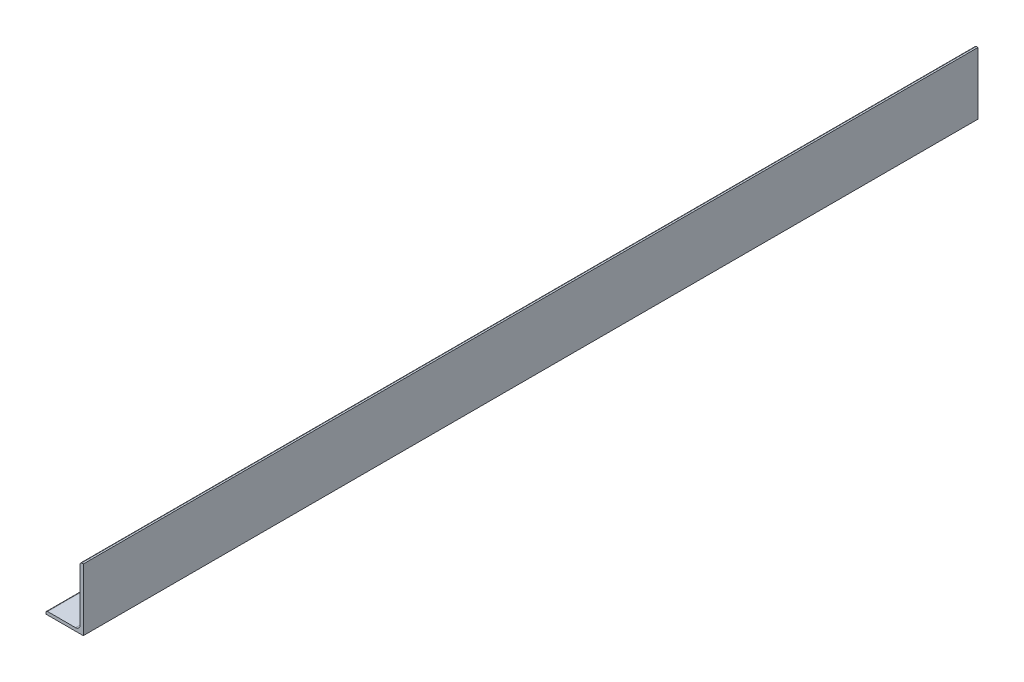
ISO-10303-21;
HEADER;
FILE_DESCRIPTION(('STEP AP214'),'2;1');
FILE_NAME('part.step','',(''),(''),'','','');
FILE_SCHEMA(('AUTOMOTIVE_DESIGN { 1 0 10303 214 1 1 1 1 }'));
ENDSEC;
DATA;
#1=APPLICATION_CONTEXT('core data for automotive mechanical design processes');
#2=APPLICATION_PROTOCOL_DEFINITION('international standard','automotive_design',2000,#1);
#3=PRODUCT_CONTEXT('',#1,'mechanical');
#4=PRODUCT('Part','Part','',(#3));
#5=PRODUCT_RELATED_PRODUCT_CATEGORY('part','',(#4));
#6=PRODUCT_DEFINITION_FORMATION('','',#4);
#7=PRODUCT_DEFINITION_CONTEXT('part definition',#1,'design');
#8=PRODUCT_DEFINITION('design','',#6,#7);
#9=PRODUCT_DEFINITION_SHAPE('','',#8);
#10=(LENGTH_UNIT() NAMED_UNIT(*) SI_UNIT(.MILLI.,.METRE.));
#11=(NAMED_UNIT(*) PLANE_ANGLE_UNIT() SI_UNIT($,.RADIAN.));
#12=(NAMED_UNIT(*) SI_UNIT($,.STERADIAN.) SOLID_ANGLE_UNIT());
#13=UNCERTAINTY_MEASURE_WITH_UNIT(LENGTH_MEASURE(1.E-05),#10,'distance_accuracy_value','');
#14=(GEOMETRIC_REPRESENTATION_CONTEXT(3) GLOBAL_UNCERTAINTY_ASSIGNED_CONTEXT((#13)) GLOBAL_UNIT_ASSIGNED_CONTEXT((#10,
#11,#12)) REPRESENTATION_CONTEXT('',''));
#15=CARTESIAN_POINT('',(0.,0.,0.));
#16=DIRECTION('',(0.,0.,1.));
#17=DIRECTION('',(1.,0.,0.));
#18=AXIS2_PLACEMENT_3D('',#15,#16,#17);
#19=CARTESIAN_POINT('',(-19.05,-30.1625,457.2));
#20=DIRECTION('',(1.,0.,0.));
#21=DIRECTION('',(0.,0.,-1.));
#22=AXIS2_PLACEMENT_3D('',#19,#20,#21);
#23=PLANE('',#22);
#24=DIRECTION('',(0.,-1.,0.));
#25=VECTOR('',#24,1.);
#26=CARTESIAN_POINT('',(-19.05,-30.1625,-457.2));
#27=LINE('',#26,#25);
#28=CARTESIAN_POINT('',(-19.05,-30.1625,-457.2));
#29=VERTEX_POINT('',#28);
#30=CARTESIAN_POINT('',(-19.05,-31.75,-457.2));
#31=VERTEX_POINT('',#30);
#32=EDGE_CURVE('E150',#29,#31,#27,.T.);
#33=ORIENTED_EDGE('',*,*,#32,.T.);
#34=DIRECTION('',(0.,0.,-1.));
#35=VECTOR('',#34,1.);
#36=CARTESIAN_POINT('',(-19.05,-31.75,457.2));
#37=LINE('',#36,#35);
#38=CARTESIAN_POINT('',(-19.05,-31.75,457.2));
#39=VERTEX_POINT('',#38);
#40=EDGE_CURVE('E11',#39,#31,#37,.T.);
#41=ORIENTED_EDGE('',*,*,#40,.F.);
#42=DIRECTION('',(0.,-1.,0.));
#43=VECTOR('',#42,1.);
#44=CARTESIAN_POINT('',(-19.05,-30.1625,457.2));
#45=LINE('',#44,#43);
#46=CARTESIAN_POINT('',(-19.05,-30.1625,457.2));
#47=VERTEX_POINT('',#46);
#48=EDGE_CURVE('E175',#47,#39,#45,.T.);
#49=ORIENTED_EDGE('',*,*,#48,.F.);
#50=DIRECTION('',(0.,0.,-1.));
#51=VECTOR('',#50,1.);
#52=CARTESIAN_POINT('',(-19.05,-30.1625,457.2));
#53=LINE('',#52,#51);
#54=EDGE_CURVE('E146',#47,#29,#53,.T.);
#55=ORIENTED_EDGE('',*,*,#54,.T.);
#56=EDGE_LOOP('',(#33,#41,#49,#55));
#57=FACE_BOUND('',#56,.T.);
#58=ADVANCED_FACE('F43',(#57),#23,.F.);
#59=CARTESIAN_POINT('',(-19.05,-31.75,457.2));
#60=DIRECTION('',(0.,1.,0.));
#61=DIRECTION('',(-1.,0.,0.));
#62=AXIS2_PLACEMENT_3D('',#59,#60,#61);
#63=PLANE('',#62);
#64=DIRECTION('',(1.,0.,0.));
#65=VECTOR('',#64,1.);
#66=CARTESIAN_POINT('',(-19.05,-31.75,-457.2));
#67=LINE('',#66,#65);
#68=CARTESIAN_POINT('',(19.05,-31.75,-457.2));
#69=VERTEX_POINT('',#68);
#70=EDGE_CURVE('E154',#31,#69,#67,.T.);
#71=ORIENTED_EDGE('',*,*,#70,.T.);
#72=DIRECTION('',(0.,0.,-1.));
#73=VECTOR('',#72,1.);
#74=CARTESIAN_POINT('',(19.05,-31.75,457.2));
#75=LINE('',#74,#73);
#76=CARTESIAN_POINT('',(19.05,-31.75,457.2));
#77=VERTEX_POINT('',#76);
#78=EDGE_CURVE('E52',#77,#69,#75,.T.);
#79=ORIENTED_EDGE('',*,*,#78,.F.);
#80=DIRECTION('',(1.,0.,0.));
#81=VECTOR('',#80,1.);
#82=CARTESIAN_POINT('',(-19.05,-31.75,457.2));
#83=LINE('',#82,#81);
#84=EDGE_CURVE('E106',#39,#77,#83,.T.);
#85=ORIENTED_EDGE('',*,*,#84,.F.);
#86=ORIENTED_EDGE('',*,*,#40,.T.);
#87=EDGE_LOOP('',(#71,#79,#85,#86));
#88=FACE_BOUND('',#87,.T.);
#89=ADVANCED_FACE('F231',(#88),#63,.F.);
#90=CARTESIAN_POINT('',(19.05,-31.75,457.2));
#91=DIRECTION('',(-1.,0.,0.));
#92=DIRECTION('',(0.,-1.,0.));
#93=AXIS2_PLACEMENT_3D('',#90,#91,#92);
#94=PLANE('',#93);
#95=DIRECTION('',(0.,1.,0.));
#96=VECTOR('',#95,1.);
#97=CARTESIAN_POINT('',(19.05,-31.75,-457.2));
#98=LINE('',#97,#96);
#99=CARTESIAN_POINT('',(19.05,31.75,-457.2));
#100=VERTEX_POINT('',#99);
#101=EDGE_CURVE('E157',#69,#100,#98,.T.);
#102=ORIENTED_EDGE('',*,*,#101,.T.);
#103=DIRECTION('',(0.,0.,-1.));
#104=VECTOR('',#103,1.);
#105=CARTESIAN_POINT('',(19.05,31.75,457.2));
#106=LINE('',#105,#104);
#107=CARTESIAN_POINT('',(19.05,31.75,457.2));
#108=VERTEX_POINT('',#107);
#109=EDGE_CURVE('E190',#108,#100,#106,.T.);
#110=ORIENTED_EDGE('',*,*,#109,.F.);
#111=DIRECTION('',(0.,1.,0.));
#112=VECTOR('',#111,1.);
#113=CARTESIAN_POINT('',(19.05,-31.75,457.2));
#114=LINE('',#113,#112);
#115=EDGE_CURVE('E200',#77,#108,#114,.T.);
#116=ORIENTED_EDGE('',*,*,#115,.F.);
#117=ORIENTED_EDGE('',*,*,#78,.T.);
#118=EDGE_LOOP('',(#102,#110,#116,#117));
#119=FACE_BOUND('',#118,.T.);
#120=ADVANCED_FACE('F198',(#119),#94,.F.);
#121=CARTESIAN_POINT('',(17.4625,31.75,457.2));
#122=DIRECTION('',(0.,-1.,0.));
#123=DIRECTION('',(1.,0.,0.));
#124=AXIS2_PLACEMENT_3D('',#121,#122,#123);
#125=PLANE('',#124);
#126=DIRECTION('',(-1.,0.,0.));
#127=VECTOR('',#126,1.);
#128=CARTESIAN_POINT('',(17.4625,31.75,-457.2));
#129=LINE('',#128,#127);
#130=CARTESIAN_POINT('',(17.4625,31.75,-457.2));
#131=VERTEX_POINT('',#130);
#132=EDGE_CURVE('E160',#100,#131,#129,.T.);
#133=ORIENTED_EDGE('',*,*,#132,.T.);
#134=DIRECTION('',(0.,0.,-1.));
#135=VECTOR('',#134,1.);
#136=CARTESIAN_POINT('',(17.4625,31.75,457.2));
#137=LINE('',#136,#135);
#138=CARTESIAN_POINT('',(17.4625,31.75,457.2));
#139=VERTEX_POINT('',#138);
#140=EDGE_CURVE('E186',#139,#131,#137,.T.);
#141=ORIENTED_EDGE('',*,*,#140,.F.);
#142=DIRECTION('',(-1.,0.,0.));
#143=VECTOR('',#142,1.);
#144=CARTESIAN_POINT('',(17.4625,31.75,457.2));
#145=LINE('',#144,#143);
#146=EDGE_CURVE('E217',#108,#139,#145,.T.);
#147=ORIENTED_EDGE('',*,*,#146,.F.);
#148=ORIENTED_EDGE('',*,*,#109,.T.);
#149=EDGE_LOOP('',(#133,#141,#147,#148));
#150=FACE_BOUND('',#149,.T.);
#151=ADVANCED_FACE('F209',(#150),#125,.F.);
#152=CARTESIAN_POINT('',(17.4625,30.1625,457.2));
#153=DIRECTION('',(0.,0.,-1.));
#154=DIRECTION('',(-1.,0.,0.));
#155=AXIS2_PLACEMENT_3D('',#152,#153,#154);
#156=CYLINDRICAL_SURFACE('',#155,1.5875);
#157=CARTESIAN_POINT('',(17.4625,30.1625,-457.2));
#158=DIRECTION('',(0.,0.,1.));
#159=DIRECTION('',(-1.,0.,0.));
#160=AXIS2_PLACEMENT_3D('',#157,#158,#159);
#161=CIRCLE('',#160,1.5875);
#162=CARTESIAN_POINT('',(15.875,30.1625,-457.2));
#163=VERTEX_POINT('',#162);
#164=EDGE_CURVE('E163',#131,#163,#161,.T.);
#165=ORIENTED_EDGE('',*,*,#164,.T.);
#166=DIRECTION('',(0.,0.,-1.));
#167=VECTOR('',#166,1.);
#168=CARTESIAN_POINT('',(15.875,30.1625,457.2));
#169=LINE('',#168,#167);
#170=CARTESIAN_POINT('',(15.875,30.1625,457.2));
#171=VERTEX_POINT('',#170);
#172=EDGE_CURVE('E182',#171,#163,#169,.T.);
#173=ORIENTED_EDGE('',*,*,#172,.F.);
#174=CARTESIAN_POINT('',(17.4625,30.1625,457.2));
#175=DIRECTION('',(0.,0.,1.));
#176=DIRECTION('',(-1.,0.,0.));
#177=AXIS2_PLACEMENT_3D('',#174,#175,#176);
#178=CIRCLE('',#177,1.5875);
#179=EDGE_CURVE('E215',#139,#171,#178,.T.);
#180=ORIENTED_EDGE('',*,*,#179,.F.);
#181=ORIENTED_EDGE('',*,*,#140,.T.);
#182=EDGE_LOOP('',(#165,#173,#180,#181));
#183=FACE_BOUND('',#182,.T.);
#184=ADVANCED_FACE('F213',(#183),#156,.T.);
#185=CARTESIAN_POINT('',(15.875,30.1625,457.2));
#186=DIRECTION('',(1.,0.,0.));
#187=DIRECTION('',(0.,1.,0.));
#188=AXIS2_PLACEMENT_3D('',#185,#186,#187);
#189=PLANE('',#188);
#190=DIRECTION('',(0.,-1.,0.));
#191=VECTOR('',#190,1.);
#192=CARTESIAN_POINT('',(15.875,30.1625,-457.2));
#193=LINE('',#192,#191);
#194=CARTESIAN_POINT('',(15.875,-23.7998,-457.2));
#195=VERTEX_POINT('',#194);
#196=EDGE_CURVE('E166',#163,#195,#193,.T.);
#197=ORIENTED_EDGE('',*,*,#196,.T.);
#198=DIRECTION('',(0.,0.,-1.));
#199=VECTOR('',#198,1.);
#200=CARTESIAN_POINT('',(15.875,-23.7998,457.2));
#201=LINE('',#200,#199);
#202=CARTESIAN_POINT('',(15.875,-23.7998,457.2));
#203=VERTEX_POINT('',#202);
#204=EDGE_CURVE('E139',#203,#195,#201,.T.);
#205=ORIENTED_EDGE('',*,*,#204,.F.);
#206=DIRECTION('',(0.,-1.,0.));
#207=VECTOR('',#206,1.);
#208=CARTESIAN_POINT('',(15.875,30.1625,457.2));
#209=LINE('',#208,#207);
#210=EDGE_CURVE('E128',#171,#203,#209,.T.);
#211=ORIENTED_EDGE('',*,*,#210,.F.);
#212=ORIENTED_EDGE('',*,*,#172,.T.);
#213=EDGE_LOOP('',(#197,#205,#211,#212));
#214=FACE_BOUND('',#213,.T.);
#215=ADVANCED_FACE('F243',(#214),#189,.F.);
#216=CARTESIAN_POINT('',(11.0998,-23.7998,457.2));
#217=DIRECTION('',(0.,0.,-1.));
#218=DIRECTION('',(-1.,0.,0.));
#219=AXIS2_PLACEMENT_3D('',#216,#217,#218);
#220=CYLINDRICAL_SURFACE('',#219,4.7752);
#221=CARTESIAN_POINT('',(11.0998,-23.7998,-457.2));
#222=DIRECTION('',(0.,0.,-1.));
#223=DIRECTION('',(-1.,0.,0.));
#224=AXIS2_PLACEMENT_3D('',#221,#222,#223);
#225=CIRCLE('',#224,4.7752);
#226=CARTESIAN_POINT('',(11.0998,-28.575,-457.2));
#227=VERTEX_POINT('',#226);
#228=EDGE_CURVE('E137',#195,#227,#225,.T.);
#229=ORIENTED_EDGE('',*,*,#228,.T.);
#230=DIRECTION('',(0.,0.,-1.));
#231=VECTOR('',#230,1.);
#232=CARTESIAN_POINT('',(11.0998,-28.575,457.2));
#233=LINE('',#232,#231);
#234=CARTESIAN_POINT('',(11.0998,-28.575,457.2));
#235=VERTEX_POINT('',#234);
#236=EDGE_CURVE('E134',#235,#227,#233,.T.);
#237=ORIENTED_EDGE('',*,*,#236,.F.);
#238=CARTESIAN_POINT('',(11.0998,-23.7998,457.2));
#239=DIRECTION('',(0.,0.,-1.));
#240=DIRECTION('',(-1.,0.,0.));
#241=AXIS2_PLACEMENT_3D('',#238,#239,#240);
#242=CIRCLE('',#241,4.7752);
#243=EDGE_CURVE('E122',#203,#235,#242,.T.);
#244=ORIENTED_EDGE('',*,*,#243,.F.);
#245=ORIENTED_EDGE('',*,*,#204,.T.);
#246=EDGE_LOOP('',(#229,#237,#244,#245));
#247=FACE_BOUND('',#246,.T.);
#248=ADVANCED_FACE('F135',(#247),#220,.F.);
#249=CARTESIAN_POINT('',(11.0998,-28.575,457.2));
#250=DIRECTION('',(0.,-1.,0.));
#251=DIRECTION('',(1.,0.,0.));
#252=AXIS2_PLACEMENT_3D('',#249,#250,#251);
#253=PLANE('',#252);
#254=DIRECTION('',(-1.,0.,0.));
#255=VECTOR('',#254,1.);
#256=CARTESIAN_POINT('',(11.0998,-28.575,-457.2));
#257=LINE('',#256,#255);
#258=CARTESIAN_POINT('',(-17.4625,-28.575,-457.2));
#259=VERTEX_POINT('',#258);
#260=EDGE_CURVE('E92',#227,#259,#257,.T.);
#261=ORIENTED_EDGE('',*,*,#260,.T.);
#262=DIRECTION('',(0.,0.,-1.));
#263=VECTOR('',#262,1.);
#264=CARTESIAN_POINT('',(-17.4625,-28.575,457.2));
#265=LINE('',#264,#263);
#266=CARTESIAN_POINT('',(-17.4625,-28.575,457.2));
#267=VERTEX_POINT('',#266);
#268=EDGE_CURVE('E140',#267,#259,#265,.T.);
#269=ORIENTED_EDGE('',*,*,#268,.F.);
#270=DIRECTION('',(-1.,0.,0.));
#271=VECTOR('',#270,1.);
#272=CARTESIAN_POINT('',(11.0998,-28.575,457.2));
#273=LINE('',#272,#271);
#274=EDGE_CURVE('E126',#235,#267,#273,.T.);
#275=ORIENTED_EDGE('',*,*,#274,.F.);
#276=ORIENTED_EDGE('',*,*,#236,.T.);
#277=EDGE_LOOP('',(#261,#269,#275,#276));
#278=FACE_BOUND('',#277,.T.);
#279=ADVANCED_FACE('F142',(#278),#253,.F.);
#280=CARTESIAN_POINT('',(-17.4625,-30.1625,457.2));
#281=DIRECTION('',(0.,0.,-1.));
#282=DIRECTION('',(-1.,0.,0.));
#283=AXIS2_PLACEMENT_3D('',#280,#281,#282);
#284=CYLINDRICAL_SURFACE('',#283,1.5875);
#285=CARTESIAN_POINT('',(-17.4625,-30.1625,-457.2));
#286=DIRECTION('',(0.,0.,1.));
#287=DIRECTION('',(-1.,0.,0.));
#288=AXIS2_PLACEMENT_3D('',#285,#286,#287);
#289=CIRCLE('',#288,1.5875);
#290=EDGE_CURVE('E98',#259,#29,#289,.T.);
#291=ORIENTED_EDGE('',*,*,#290,.T.);
#292=ORIENTED_EDGE('',*,*,#54,.F.);
#293=CARTESIAN_POINT('',(-17.4625,-30.1625,457.2));
#294=DIRECTION('',(0.,0.,1.));
#295=DIRECTION('',(-1.,0.,0.));
#296=AXIS2_PLACEMENT_3D('',#293,#294,#295);
#297=CIRCLE('',#296,1.5875);
#298=EDGE_CURVE('E60',#267,#47,#297,.T.);
#299=ORIENTED_EDGE('',*,*,#298,.F.);
#300=ORIENTED_EDGE('',*,*,#268,.T.);
#301=EDGE_LOOP('',(#291,#292,#299,#300));
#302=FACE_BOUND('',#301,.T.);
#303=ADVANCED_FACE('F251',(#302),#284,.T.);
#304=CARTESIAN_POINT('',(17.4625,30.1625,457.2));
#305=DIRECTION('',(0.,0.,-1.));
#306=DIRECTION('',(-1.,0.,0.));
#307=AXIS2_PLACEMENT_3D('',#304,#305,#306);
#308=PLANE('',#307);
#309=ORIENTED_EDGE('',*,*,#48,.T.);
#310=ORIENTED_EDGE('',*,*,#84,.T.);
#311=ORIENTED_EDGE('',*,*,#115,.T.);
#312=ORIENTED_EDGE('',*,*,#146,.T.);
#313=ORIENTED_EDGE('',*,*,#179,.T.);
#314=ORIENTED_EDGE('',*,*,#210,.T.);
#315=ORIENTED_EDGE('',*,*,#243,.T.);
#316=ORIENTED_EDGE('',*,*,#274,.T.);
#317=ORIENTED_EDGE('',*,*,#298,.T.);
#318=EDGE_LOOP('',(#309,#310,#311,#312,#313,#314,#315,#316,#317));
#319=FACE_BOUND('',#318,.T.);
#320=ADVANCED_FACE('F124',(#319),#308,.F.);
#321=CARTESIAN_POINT('',(17.4625,30.1625,-457.2));
#322=DIRECTION('',(0.,0.,-1.));
#323=DIRECTION('',(-1.,0.,0.));
#324=AXIS2_PLACEMENT_3D('',#321,#322,#323);
#325=PLANE('',#324);
#326=ORIENTED_EDGE('',*,*,#32,.F.);
#327=ORIENTED_EDGE('',*,*,#290,.F.);
#328=ORIENTED_EDGE('',*,*,#260,.F.);
#329=ORIENTED_EDGE('',*,*,#228,.F.);
#330=ORIENTED_EDGE('',*,*,#196,.F.);
#331=ORIENTED_EDGE('',*,*,#164,.F.);
#332=ORIENTED_EDGE('',*,*,#132,.F.);
#333=ORIENTED_EDGE('',*,*,#101,.F.);
#334=ORIENTED_EDGE('',*,*,#70,.F.);
#335=EDGE_LOOP('',(#326,#327,#328,#329,#330,#331,#332,#333,#334));
#336=FACE_BOUND('',#335,.T.);
#337=ADVANCED_FACE('F204',(#336),#325,.T.);
#338=CLOSED_SHELL('',(#58,#89,#120,#151,#184,#215,#248,#279,#303,#320,#337));
#339=MANIFOLD_SOLID_BREP('B2',#338);
#340=ADVANCED_BREP_SHAPE_REPRESENTATION('',(#18,#339),#14);
#341=SHAPE_DEFINITION_REPRESENTATION(#9,#340);
ENDSEC;
END-ISO-10303-21;
